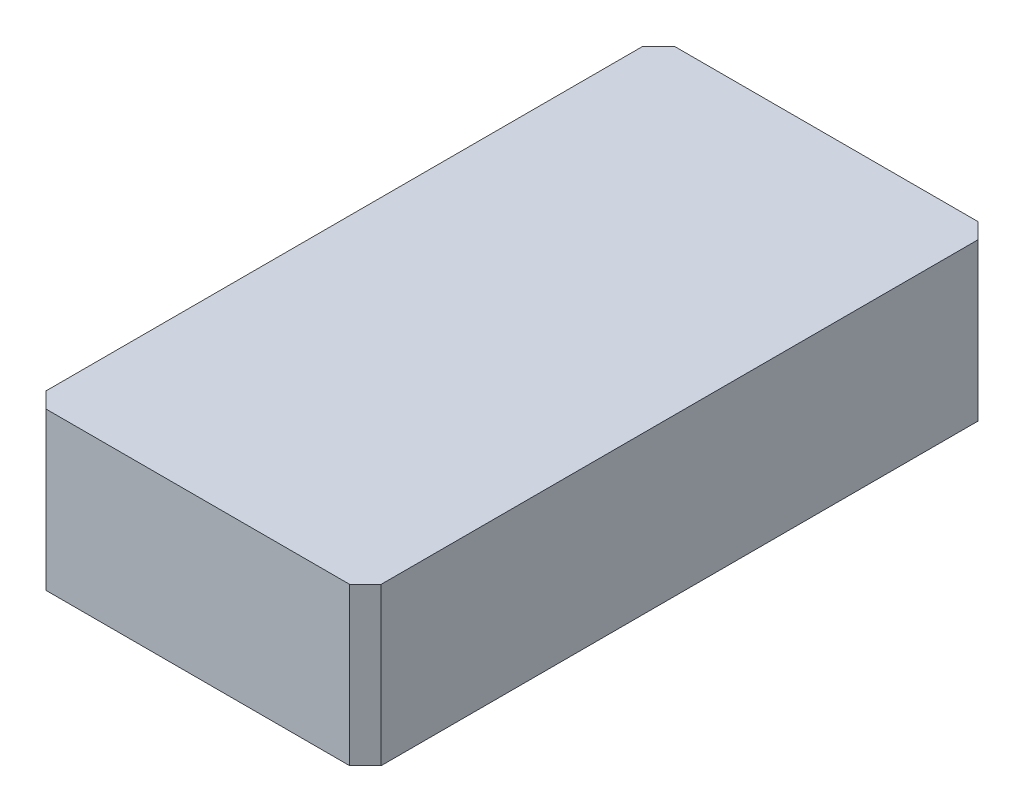
ISO-10303-21;
HEADER;
FILE_DESCRIPTION(('STEP AP214'),'2;1');
FILE_NAME('part.step','',(''),(''),'','','');
FILE_SCHEMA(('AUTOMOTIVE_DESIGN { 1 0 10303 214 1 1 1 1 }'));
ENDSEC;
DATA;
#1=APPLICATION_CONTEXT('core data for automotive mechanical design processes');
#2=APPLICATION_PROTOCOL_DEFINITION('international standard','automotive_design',2000,#1);
#3=PRODUCT_CONTEXT('',#1,'mechanical');
#4=PRODUCT('Part','Part','',(#3));
#5=PRODUCT_RELATED_PRODUCT_CATEGORY('part','',(#4));
#6=PRODUCT_DEFINITION_FORMATION('','',#4);
#7=PRODUCT_DEFINITION_CONTEXT('part definition',#1,'design');
#8=PRODUCT_DEFINITION('design','',#6,#7);
#9=PRODUCT_DEFINITION_SHAPE('','',#8);
#10=(LENGTH_UNIT() NAMED_UNIT(*) SI_UNIT(.MILLI.,.METRE.));
#11=(NAMED_UNIT(*) PLANE_ANGLE_UNIT() SI_UNIT($,.RADIAN.));
#12=(NAMED_UNIT(*) SI_UNIT($,.STERADIAN.) SOLID_ANGLE_UNIT());
#13=UNCERTAINTY_MEASURE_WITH_UNIT(LENGTH_MEASURE(1.E-05),#10,'distance_accuracy_value','');
#14=(GEOMETRIC_REPRESENTATION_CONTEXT(3) GLOBAL_UNCERTAINTY_ASSIGNED_CONTEXT((#13)) GLOBAL_UNIT_ASSIGNED_CONTEXT((#10,
#11,#12)) REPRESENTATION_CONTEXT('',''));
#15=CARTESIAN_POINT('',(0.,0.,0.));
#16=DIRECTION('',(0.,0.,1.));
#17=DIRECTION('',(1.,0.,0.));
#18=AXIS2_PLACEMENT_3D('',#15,#16,#17);
#19=CARTESIAN_POINT('',(-16.,15.,28.5));
#20=DIRECTION('',(0.707106781186547,0.,-0.707106781186548));
#21=DIRECTION('',(-0.707106781186548,0.,-0.707106781186547));
#22=AXIS2_PLACEMENT_3D('',#19,#20,#21);
#23=PLANE('',#22);
#24=DIRECTION('',(0.707106781186548,0.,0.707106781186547));
#25=VECTOR('',#24,1.);
#26=CARTESIAN_POINT('',(-16.,0.,28.5));
#27=LINE('',#26,#25);
#28=CARTESIAN_POINT('',(-16.,0.,28.5));
#29=VERTEX_POINT('',#28);
#30=CARTESIAN_POINT('',(-14.5,0.,30.));
#31=VERTEX_POINT('',#30);
#32=EDGE_CURVE('E137',#29,#31,#27,.T.);
#33=ORIENTED_EDGE('',*,*,#32,.T.);
#34=DIRECTION('',(0.,-1.,0.));
#35=VECTOR('',#34,1.);
#36=CARTESIAN_POINT('',(-14.5,15.,30.));
#37=LINE('',#36,#35);
#38=CARTESIAN_POINT('',(-14.5,15.,30.));
#39=VERTEX_POINT('',#38);
#40=EDGE_CURVE('E11',#39,#31,#37,.T.);
#41=ORIENTED_EDGE('',*,*,#40,.F.);
#42=DIRECTION('',(0.707106781186548,0.,0.707106781186547));
#43=VECTOR('',#42,1.);
#44=CARTESIAN_POINT('',(-16.,15.,28.5));
#45=LINE('',#44,#43);
#46=CARTESIAN_POINT('',(-16.,15.,28.5));
#47=VERTEX_POINT('',#46);
#48=EDGE_CURVE('E151',#47,#39,#45,.T.);
#49=ORIENTED_EDGE('',*,*,#48,.F.);
#50=DIRECTION('',(0.,-1.,0.));
#51=VECTOR('',#50,1.);
#52=CARTESIAN_POINT('',(-16.,15.,28.5));
#53=LINE('',#52,#51);
#54=EDGE_CURVE('E133',#47,#29,#53,.T.);
#55=ORIENTED_EDGE('',*,*,#54,.T.);
#56=EDGE_LOOP('',(#33,#41,#49,#55));
#57=FACE_BOUND('',#56,.T.);
#58=ADVANCED_FACE('F41',(#57),#23,.F.);
#59=CARTESIAN_POINT('',(-14.5,15.,30.));
#60=DIRECTION('',(0.,0.,-1.));
#61=DIRECTION('',(-1.,0.,0.));
#62=AXIS2_PLACEMENT_3D('',#59,#60,#61);
#63=PLANE('',#62);
#64=DIRECTION('',(1.,0.,0.));
#65=VECTOR('',#64,1.);
#66=CARTESIAN_POINT('',(-14.5,0.,30.));
#67=LINE('',#66,#65);
#68=CARTESIAN_POINT('',(14.5,0.,30.));
#69=VERTEX_POINT('',#68);
#70=EDGE_CURVE('E140',#31,#69,#67,.T.);
#71=ORIENTED_EDGE('',*,*,#70,.T.);
#72=DIRECTION('',(0.,-1.,0.));
#73=VECTOR('',#72,1.);
#74=CARTESIAN_POINT('',(14.5,15.,30.));
#75=LINE('',#74,#73);
#76=CARTESIAN_POINT('',(14.5,15.,30.));
#77=VERTEX_POINT('',#76);
#78=EDGE_CURVE('E49',#77,#69,#75,.T.);
#79=ORIENTED_EDGE('',*,*,#78,.F.);
#80=DIRECTION('',(1.,0.,0.));
#81=VECTOR('',#80,1.);
#82=CARTESIAN_POINT('',(-14.5,15.,30.));
#83=LINE('',#82,#81);
#84=EDGE_CURVE('E100',#39,#77,#83,.T.);
#85=ORIENTED_EDGE('',*,*,#84,.F.);
#86=ORIENTED_EDGE('',*,*,#40,.T.);
#87=EDGE_LOOP('',(#71,#79,#85,#86));
#88=FACE_BOUND('',#87,.T.);
#89=ADVANCED_FACE('F186',(#88),#63,.F.);
#90=CARTESIAN_POINT('',(14.5,15.,30.));
#91=DIRECTION('',(-0.707106781186547,0.,-0.707106781186548));
#92=DIRECTION('',(-0.707106781186548,0.,0.707106781186547));
#93=AXIS2_PLACEMENT_3D('',#90,#91,#92);
#94=PLANE('',#93);
#95=DIRECTION('',(0.707106781186548,0.,-0.707106781186547));
#96=VECTOR('',#95,1.);
#97=CARTESIAN_POINT('',(14.5,0.,30.));
#98=LINE('',#97,#96);
#99=CARTESIAN_POINT('',(16.,0.,28.5));
#100=VERTEX_POINT('',#99);
#101=EDGE_CURVE('E142',#69,#100,#98,.T.);
#102=ORIENTED_EDGE('',*,*,#101,.T.);
#103=DIRECTION('',(0.,-1.,0.));
#104=VECTOR('',#103,1.);
#105=CARTESIAN_POINT('',(16.,15.,28.5));
#106=LINE('',#105,#104);
#107=CARTESIAN_POINT('',(16.,15.,28.5));
#108=VERTEX_POINT('',#107);
#109=EDGE_CURVE('E158',#108,#100,#106,.T.);
#110=ORIENTED_EDGE('',*,*,#109,.F.);
#111=DIRECTION('',(0.707106781186548,0.,-0.707106781186547));
#112=VECTOR('',#111,1.);
#113=CARTESIAN_POINT('',(14.5,15.,30.));
#114=LINE('',#113,#112);
#115=EDGE_CURVE('E166',#77,#108,#114,.T.);
#116=ORIENTED_EDGE('',*,*,#115,.F.);
#117=ORIENTED_EDGE('',*,*,#78,.T.);
#118=EDGE_LOOP('',(#102,#110,#116,#117));
#119=FACE_BOUND('',#118,.T.);
#120=ADVANCED_FACE('F164',(#119),#94,.F.);
#121=CARTESIAN_POINT('',(16.,15.,28.5));
#122=DIRECTION('',(-1.,0.,0.));
#123=DIRECTION('',(0.,0.,1.));
#124=AXIS2_PLACEMENT_3D('',#121,#122,#123);
#125=PLANE('',#124);
#126=DIRECTION('',(0.,0.,-1.));
#127=VECTOR('',#126,1.);
#128=CARTESIAN_POINT('',(16.,0.,28.5));
#129=LINE('',#128,#127);
#130=CARTESIAN_POINT('',(16.,0.,-28.5));
#131=VERTEX_POINT('',#130);
#132=EDGE_CURVE('E144',#100,#131,#129,.T.);
#133=ORIENTED_EDGE('',*,*,#132,.T.);
#134=DIRECTION('',(0.,-1.,0.));
#135=VECTOR('',#134,1.);
#136=CARTESIAN_POINT('',(16.,15.,-28.5));
#137=LINE('',#136,#135);
#138=CARTESIAN_POINT('',(16.,15.,-28.5));
#139=VERTEX_POINT('',#138);
#140=EDGE_CURVE('E155',#139,#131,#137,.T.);
#141=ORIENTED_EDGE('',*,*,#140,.F.);
#142=DIRECTION('',(0.,0.,-1.));
#143=VECTOR('',#142,1.);
#144=CARTESIAN_POINT('',(16.,15.,28.5));
#145=LINE('',#144,#143);
#146=EDGE_CURVE('E178',#108,#139,#145,.T.);
#147=ORIENTED_EDGE('',*,*,#146,.F.);
#148=ORIENTED_EDGE('',*,*,#109,.T.);
#149=EDGE_LOOP('',(#133,#141,#147,#148));
#150=FACE_BOUND('',#149,.T.);
#151=ADVANCED_FACE('F174',(#150),#125,.F.);
#152=CARTESIAN_POINT('',(16.,15.,-28.5));
#153=DIRECTION('',(-0.707106781186547,0.,0.707106781186548));
#154=DIRECTION('',(0.707106781186548,0.,0.707106781186547));
#155=AXIS2_PLACEMENT_3D('',#152,#153,#154);
#156=PLANE('',#155);
#157=DIRECTION('',(-0.707106781186548,0.,-0.707106781186547));
#158=VECTOR('',#157,1.);
#159=CARTESIAN_POINT('',(16.,0.,-28.5));
#160=LINE('',#159,#158);
#161=CARTESIAN_POINT('',(14.5,0.,-30.));
#162=VERTEX_POINT('',#161);
#163=EDGE_CURVE('E146',#131,#162,#160,.T.);
#164=ORIENTED_EDGE('',*,*,#163,.T.);
#165=DIRECTION('',(0.,-1.,0.));
#166=VECTOR('',#165,1.);
#167=CARTESIAN_POINT('',(14.5,15.,-30.));
#168=LINE('',#167,#166);
#169=CARTESIAN_POINT('',(14.5,15.,-30.));
#170=VERTEX_POINT('',#169);
#171=EDGE_CURVE('E128',#170,#162,#168,.T.);
#172=ORIENTED_EDGE('',*,*,#171,.F.);
#173=DIRECTION('',(-0.707106781186548,0.,-0.707106781186547));
#174=VECTOR('',#173,1.);
#175=CARTESIAN_POINT('',(16.,15.,-28.5));
#176=LINE('',#175,#174);
#177=EDGE_CURVE('E119',#139,#170,#176,.T.);
#178=ORIENTED_EDGE('',*,*,#177,.F.);
#179=ORIENTED_EDGE('',*,*,#140,.T.);
#180=EDGE_LOOP('',(#164,#172,#178,#179));
#181=FACE_BOUND('',#180,.T.);
#182=ADVANCED_FACE('F177',(#181),#156,.F.);
#183=CARTESIAN_POINT('',(14.5,15.,-30.));
#184=DIRECTION('',(0.,0.,1.));
#185=DIRECTION('',(1.,0.,0.));
#186=AXIS2_PLACEMENT_3D('',#183,#184,#185);
#187=PLANE('',#186);
#188=DIRECTION('',(-1.,0.,0.));
#189=VECTOR('',#188,1.);
#190=CARTESIAN_POINT('',(14.5,0.,-30.));
#191=LINE('',#190,#189);
#192=CARTESIAN_POINT('',(-14.5,0.,-30.));
#193=VERTEX_POINT('',#192);
#194=EDGE_CURVE('E127',#162,#193,#191,.T.);
#195=ORIENTED_EDGE('',*,*,#194,.T.);
#196=DIRECTION('',(0.,-1.,0.));
#197=VECTOR('',#196,1.);
#198=CARTESIAN_POINT('',(-14.5,15.,-30.));
#199=LINE('',#198,#197);
#200=CARTESIAN_POINT('',(-14.5,15.,-30.));
#201=VERTEX_POINT('',#200);
#202=EDGE_CURVE('E124',#201,#193,#199,.T.);
#203=ORIENTED_EDGE('',*,*,#202,.F.);
#204=DIRECTION('',(-1.,0.,0.));
#205=VECTOR('',#204,1.);
#206=CARTESIAN_POINT('',(14.5,15.,-30.));
#207=LINE('',#206,#205);
#208=EDGE_CURVE('E113',#170,#201,#207,.T.);
#209=ORIENTED_EDGE('',*,*,#208,.F.);
#210=ORIENTED_EDGE('',*,*,#171,.T.);
#211=EDGE_LOOP('',(#195,#203,#209,#210));
#212=FACE_BOUND('',#211,.T.);
#213=ADVANCED_FACE('F125',(#212),#187,.F.);
#214=CARTESIAN_POINT('',(-14.5,15.,-30.));
#215=DIRECTION('',(0.707106781186547,0.,0.707106781186548));
#216=DIRECTION('',(0.707106781186548,0.,-0.707106781186547));
#217=AXIS2_PLACEMENT_3D('',#214,#215,#216);
#218=PLANE('',#217);
#219=DIRECTION('',(-0.707106781186548,0.,0.707106781186547));
#220=VECTOR('',#219,1.);
#221=CARTESIAN_POINT('',(-14.5,0.,-30.));
#222=LINE('',#221,#220);
#223=CARTESIAN_POINT('',(-16.,0.,-28.5));
#224=VERTEX_POINT('',#223);
#225=EDGE_CURVE('E86',#193,#224,#222,.T.);
#226=ORIENTED_EDGE('',*,*,#225,.T.);
#227=DIRECTION('',(0.,-1.,0.));
#228=VECTOR('',#227,1.);
#229=CARTESIAN_POINT('',(-16.,15.,-28.5));
#230=LINE('',#229,#228);
#231=CARTESIAN_POINT('',(-16.,15.,-28.5));
#232=VERTEX_POINT('',#231);
#233=EDGE_CURVE('E129',#232,#224,#230,.T.);
#234=ORIENTED_EDGE('',*,*,#233,.F.);
#235=DIRECTION('',(-0.707106781186548,0.,0.707106781186547));
#236=VECTOR('',#235,1.);
#237=CARTESIAN_POINT('',(-14.5,15.,-30.));
#238=LINE('',#237,#236);
#239=EDGE_CURVE('E117',#201,#232,#238,.T.);
#240=ORIENTED_EDGE('',*,*,#239,.F.);
#241=ORIENTED_EDGE('',*,*,#202,.T.);
#242=EDGE_LOOP('',(#226,#234,#240,#241));
#243=FACE_BOUND('',#242,.T.);
#244=ADVANCED_FACE('F131',(#243),#218,.F.);
#245=CARTESIAN_POINT('',(-16.,15.,-28.5));
#246=DIRECTION('',(1.,0.,0.));
#247=DIRECTION('',(0.,0.,-1.));
#248=AXIS2_PLACEMENT_3D('',#245,#246,#247);
#249=PLANE('',#248);
#250=DIRECTION('',(0.,0.,1.));
#251=VECTOR('',#250,1.);
#252=CARTESIAN_POINT('',(-16.,0.,-28.5));
#253=LINE('',#252,#251);
#254=EDGE_CURVE('E92',#224,#29,#253,.T.);
#255=ORIENTED_EDGE('',*,*,#254,.T.);
#256=ORIENTED_EDGE('',*,*,#54,.F.);
#257=DIRECTION('',(0.,0.,1.));
#258=VECTOR('',#257,1.);
#259=CARTESIAN_POINT('',(-16.,15.,-28.5));
#260=LINE('',#259,#258);
#261=EDGE_CURVE('E57',#232,#47,#260,.T.);
#262=ORIENTED_EDGE('',*,*,#261,.F.);
#263=ORIENTED_EDGE('',*,*,#233,.T.);
#264=EDGE_LOOP('',(#255,#256,#262,#263));
#265=FACE_BOUND('',#264,.T.);
#266=ADVANCED_FACE('F202',(#265),#249,.F.);
#267=CARTESIAN_POINT('',(0.,15.,0.));
#268=DIRECTION('',(0.,1.,0.));
#269=DIRECTION('',(0.,0.,1.));
#270=AXIS2_PLACEMENT_3D('',#267,#268,#269);
#271=PLANE('',#270);
#272=ORIENTED_EDGE('',*,*,#48,.T.);
#273=ORIENTED_EDGE('',*,*,#84,.T.);
#274=ORIENTED_EDGE('',*,*,#115,.T.);
#275=ORIENTED_EDGE('',*,*,#146,.T.);
#276=ORIENTED_EDGE('',*,*,#177,.T.);
#277=ORIENTED_EDGE('',*,*,#208,.T.);
#278=ORIENTED_EDGE('',*,*,#239,.T.);
#279=ORIENTED_EDGE('',*,*,#261,.T.);
#280=EDGE_LOOP('',(#272,#273,#274,#275,#276,#277,#278,#279));
#281=FACE_BOUND('',#280,.T.);
#282=ADVANCED_FACE('F115',(#281),#271,.T.);
#283=CARTESIAN_POINT('',(0.,0.,0.));
#284=DIRECTION('',(0.,1.,0.));
#285=DIRECTION('',(0.,0.,1.));
#286=AXIS2_PLACEMENT_3D('',#283,#284,#285);
#287=PLANE('',#286);
#288=ORIENTED_EDGE('',*,*,#32,.F.);
#289=ORIENTED_EDGE('',*,*,#254,.F.);
#290=ORIENTED_EDGE('',*,*,#225,.F.);
#291=ORIENTED_EDGE('',*,*,#194,.F.);
#292=ORIENTED_EDGE('',*,*,#163,.F.);
#293=ORIENTED_EDGE('',*,*,#132,.F.);
#294=ORIENTED_EDGE('',*,*,#101,.F.);
#295=ORIENTED_EDGE('',*,*,#70,.F.);
#296=EDGE_LOOP('',(#288,#289,#290,#291,#292,#293,#294,#295));
#297=FACE_BOUND('',#296,.T.);
#298=ADVANCED_FACE('F170',(#297),#287,.F.);
#299=CLOSED_SHELL('',(#58,#89,#120,#151,#182,#213,#244,#266,#282,#298));
#300=MANIFOLD_SOLID_BREP('B2',#299);
#301=ADVANCED_BREP_SHAPE_REPRESENTATION('',(#18,#300),#14);
#302=SHAPE_DEFINITION_REPRESENTATION(#9,#301);
ENDSEC;
END-ISO-10303-21;
